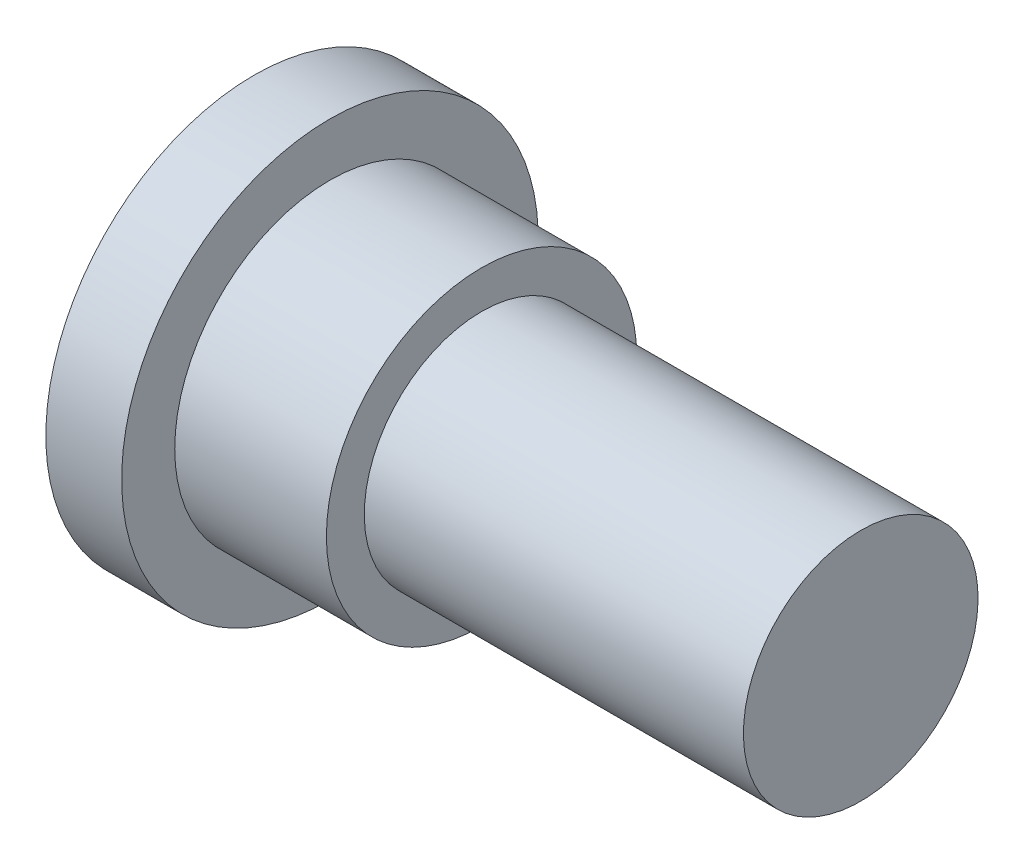
ISO-10303-21;
HEADER;
FILE_DESCRIPTION(('STEP AP214'),'2;1');
FILE_NAME('part.step','',(''),(''),'','','');
FILE_SCHEMA(('AUTOMOTIVE_DESIGN { 1 0 10303 214 1 1 1 1 }'));
ENDSEC;
DATA;
#1=APPLICATION_CONTEXT('core data for automotive mechanical design processes');
#2=APPLICATION_PROTOCOL_DEFINITION('international standard','automotive_design',2000,#1);
#3=PRODUCT_CONTEXT('',#1,'mechanical');
#4=PRODUCT('Part','Part','',(#3));
#5=PRODUCT_RELATED_PRODUCT_CATEGORY('part','',(#4));
#6=PRODUCT_DEFINITION_FORMATION('','',#4);
#7=PRODUCT_DEFINITION_CONTEXT('part definition',#1,'design');
#8=PRODUCT_DEFINITION('design','',#6,#7);
#9=PRODUCT_DEFINITION_SHAPE('','',#8);
#10=(LENGTH_UNIT() NAMED_UNIT(*) SI_UNIT(.MILLI.,.METRE.));
#11=(NAMED_UNIT(*) PLANE_ANGLE_UNIT() SI_UNIT($,.RADIAN.));
#12=(NAMED_UNIT(*) SI_UNIT($,.STERADIAN.) SOLID_ANGLE_UNIT());
#13=UNCERTAINTY_MEASURE_WITH_UNIT(LENGTH_MEASURE(1.E-05),#10,'distance_accuracy_value','');
#14=(GEOMETRIC_REPRESENTATION_CONTEXT(3) GLOBAL_UNCERTAINTY_ASSIGNED_CONTEXT((#13)) GLOBAL_UNIT_ASSIGNED_CONTEXT((#10,
#11,#12)) REPRESENTATION_CONTEXT('',''));
#15=CARTESIAN_POINT('',(0.,0.,0.));
#16=DIRECTION('',(0.,0.,1.));
#17=DIRECTION('',(1.,0.,0.));
#18=AXIS2_PLACEMENT_3D('',#15,#16,#17);
#19=CARTESIAN_POINT('',(0.,0.,0.));
#20=DIRECTION('',(-1.,0.,0.));
#21=DIRECTION('',(0.,-1.,0.));
#22=AXIS2_PLACEMENT_3D('',#19,#20,#21);
#23=PLANE('',#22);
#24=CARTESIAN_POINT('',(0.,0.,0.));
#25=DIRECTION('',(1.,0.,0.));
#26=DIRECTION('',(0.,1.,0.));
#27=AXIS2_PLACEMENT_3D('',#24,#25,#26);
#28=CIRCLE('',#27,27.4705690745135);
#29=CARTESIAN_POINT('',(0.,27.4705690745135,0.));
#30=VERTEX_POINT('',#29);
#31=EDGE_CURVE('E10',#30,#30,#28,.T.);
#32=ORIENTED_EDGE('',*,*,#31,.F.);
#33=EDGE_LOOP('',(#32));
#34=FACE_BOUND('',#33,.T.);
#35=ADVANCED_FACE('F37',(#34),#23,.T.);
#36=CARTESIAN_POINT('',(80.,0.,0.));
#37=DIRECTION('',(1.,0.,0.));
#38=DIRECTION('',(0.,1.,0.));
#39=AXIS2_PLACEMENT_3D('',#36,#37,#38);
#40=CYLINDRICAL_SURFACE('',#39,27.4705690745135);
#41=ORIENTED_EDGE('',*,*,#31,.T.);
#42=EDGE_LOOP('',(#41));
#43=FACE_BOUND('',#42,.T.);
#44=CARTESIAN_POINT('',(9.99999999999999,0.,0.));
#45=DIRECTION('',(1.,0.,0.));
#46=DIRECTION('',(0.,1.,0.));
#47=AXIS2_PLACEMENT_3D('',#44,#45,#46);
#48=CIRCLE('',#47,27.4705690745135);
#49=CARTESIAN_POINT('',(9.99999999999999,27.4705690745135,0.));
#50=VERTEX_POINT('',#49);
#51=EDGE_CURVE('E43',#50,#50,#48,.T.);
#52=ORIENTED_EDGE('',*,*,#51,.F.);
#53=EDGE_LOOP('',(#52));
#54=FACE_BOUND('',#53,.T.);
#55=ADVANCED_FACE('F79',(#43,#54),#40,.T.);
#56=CARTESIAN_POINT('',(9.99999999999999,27.4705690745135,0.));
#57=DIRECTION('',(1.,0.,0.));
#58=DIRECTION('',(0.,1.,0.));
#59=AXIS2_PLACEMENT_3D('',#56,#57,#58);
#60=PLANE('',#59);
#61=ORIENTED_EDGE('',*,*,#51,.T.);
#62=EDGE_LOOP('',(#61));
#63=FACE_BOUND('',#62,.T.);
#64=CARTESIAN_POINT('',(9.99999999999999,0.,0.));
#65=DIRECTION('',(1.,0.,0.));
#66=DIRECTION('',(0.,1.,0.));
#67=AXIS2_PLACEMENT_3D('',#64,#65,#66);
#68=CIRCLE('',#67,20.4705690745135);
#69=CARTESIAN_POINT('',(9.99999999999999,20.4705690745135,0.));
#70=VERTEX_POINT('',#69);
#71=EDGE_CURVE('E47',#70,#70,#68,.T.);
#72=ORIENTED_EDGE('',*,*,#71,.F.);
#73=EDGE_LOOP('',(#72));
#74=FACE_BOUND('',#73,.T.);
#75=ADVANCED_FACE('F84',(#63,#74),#60,.T.);
#76=CARTESIAN_POINT('',(80.,0.,0.));
#77=DIRECTION('',(1.,0.,0.));
#78=DIRECTION('',(0.,1.,0.));
#79=AXIS2_PLACEMENT_3D('',#76,#77,#78);
#80=CYLINDRICAL_SURFACE('',#79,20.4705690745135);
#81=ORIENTED_EDGE('',*,*,#71,.T.);
#82=EDGE_LOOP('',(#81));
#83=FACE_BOUND('',#82,.T.);
#84=CARTESIAN_POINT('',(30.,0.,0.));
#85=DIRECTION('',(1.,0.,0.));
#86=DIRECTION('',(0.,1.,0.));
#87=AXIS2_PLACEMENT_3D('',#84,#85,#86);
#88=CIRCLE('',#87,20.4705690745135);
#89=CARTESIAN_POINT('',(30.,20.4705690745135,0.));
#90=VERTEX_POINT('',#89);
#91=EDGE_CURVE('E51',#90,#90,#88,.T.);
#92=ORIENTED_EDGE('',*,*,#91,.F.);
#93=EDGE_LOOP('',(#92));
#94=FACE_BOUND('',#93,.T.);
#95=ADVANCED_FACE('F75',(#83,#94),#80,.T.);
#96=CARTESIAN_POINT('',(30.,20.4705690745135,0.));
#97=DIRECTION('',(1.,0.,0.));
#98=DIRECTION('',(0.,1.,0.));
#99=AXIS2_PLACEMENT_3D('',#96,#97,#98);
#100=PLANE('',#99);
#101=ORIENTED_EDGE('',*,*,#91,.T.);
#102=EDGE_LOOP('',(#101));
#103=FACE_BOUND('',#102,.T.);
#104=CARTESIAN_POINT('',(30.,0.,0.));
#105=DIRECTION('',(1.,0.,0.));
#106=DIRECTION('',(0.,1.,0.));
#107=AXIS2_PLACEMENT_3D('',#104,#105,#106);
#108=CIRCLE('',#107,15.4705690745135);
#109=CARTESIAN_POINT('',(30.,15.4705690745135,0.));
#110=VERTEX_POINT('',#109);
#111=EDGE_CURVE('E56',#110,#110,#108,.T.);
#112=ORIENTED_EDGE('',*,*,#111,.F.);
#113=EDGE_LOOP('',(#112));
#114=FACE_BOUND('',#113,.T.);
#115=ADVANCED_FACE('F67',(#103,#114),#100,.T.);
#116=CARTESIAN_POINT('',(80.,0.,0.));
#117=DIRECTION('',(1.,0.,0.));
#118=DIRECTION('',(0.,1.,0.));
#119=AXIS2_PLACEMENT_3D('',#116,#117,#118);
#120=CYLINDRICAL_SURFACE('',#119,15.4705690745135);
#121=ORIENTED_EDGE('',*,*,#111,.T.);
#122=EDGE_LOOP('',(#121));
#123=FACE_BOUND('',#122,.T.);
#124=CARTESIAN_POINT('',(80.,0.,0.));
#125=DIRECTION('',(1.,0.,0.));
#126=DIRECTION('',(0.,1.,0.));
#127=AXIS2_PLACEMENT_3D('',#124,#125,#126);
#128=CIRCLE('',#127,15.4705690745135);
#129=CARTESIAN_POINT('',(80.,15.4705690745135,0.));
#130=VERTEX_POINT('',#129);
#131=EDGE_CURVE('E59',#130,#130,#128,.T.);
#132=ORIENTED_EDGE('',*,*,#131,.F.);
#133=EDGE_LOOP('',(#132));
#134=FACE_BOUND('',#133,.T.);
#135=ADVANCED_FACE('F65',(#123,#134),#120,.T.);
#136=CARTESIAN_POINT('',(80.,15.4705690745135,0.));
#137=DIRECTION('',(1.,0.,0.));
#138=DIRECTION('',(0.,1.,0.));
#139=AXIS2_PLACEMENT_3D('',#136,#137,#138);
#140=PLANE('',#139);
#141=ORIENTED_EDGE('',*,*,#131,.T.);
#142=EDGE_LOOP('',(#141));
#143=FACE_BOUND('',#142,.T.);
#144=ADVANCED_FACE('F63',(#143),#140,.T.);
#145=CLOSED_SHELL('',(#35,#55,#75,#95,#115,#135,#144));
#146=MANIFOLD_SOLID_BREP('B2',#145);
#147=ADVANCED_BREP_SHAPE_REPRESENTATION('',(#18,#146),#14);
#148=SHAPE_DEFINITION_REPRESENTATION(#9,#147);
ENDSEC;
END-ISO-10303-21;
